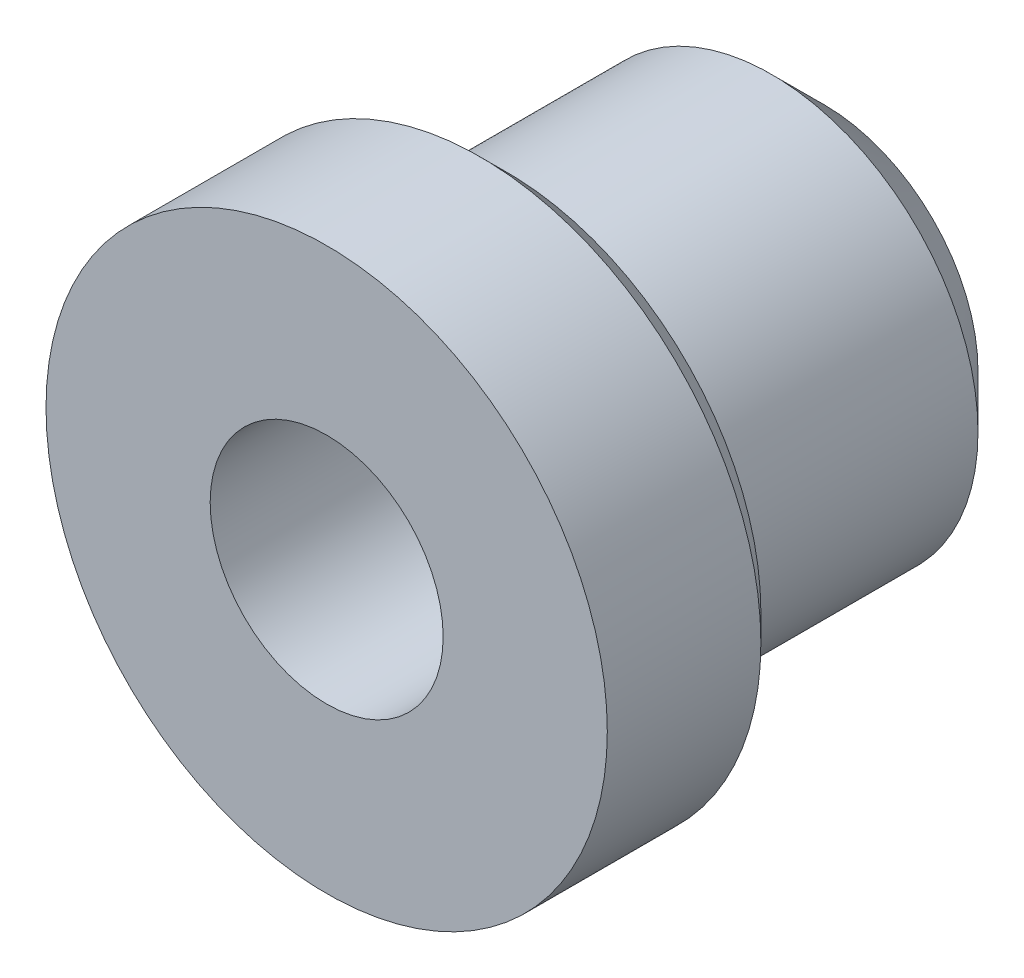
ISO-10303-21;
HEADER;
FILE_DESCRIPTION(('STEP AP214'),'2;1');
FILE_NAME('part.step','',(''),(''),'','','');
FILE_SCHEMA(('AUTOMOTIVE_DESIGN { 1 0 10303 214 1 1 1 1 }'));
ENDSEC;
DATA;
#1=APPLICATION_CONTEXT('core data for automotive mechanical design processes');
#2=APPLICATION_PROTOCOL_DEFINITION('international standard','automotive_design',2000,#1);
#3=PRODUCT_CONTEXT('',#1,'mechanical');
#4=PRODUCT('Part','Part','',(#3));
#5=PRODUCT_RELATED_PRODUCT_CATEGORY('part','',(#4));
#6=PRODUCT_DEFINITION_FORMATION('','',#4);
#7=PRODUCT_DEFINITION_CONTEXT('part definition',#1,'design');
#8=PRODUCT_DEFINITION('design','',#6,#7);
#9=PRODUCT_DEFINITION_SHAPE('','',#8);
#10=(LENGTH_UNIT() NAMED_UNIT(*) SI_UNIT(.MILLI.,.METRE.));
#11=(NAMED_UNIT(*) PLANE_ANGLE_UNIT() SI_UNIT($,.RADIAN.));
#12=(NAMED_UNIT(*) SI_UNIT($,.STERADIAN.) SOLID_ANGLE_UNIT());
#13=UNCERTAINTY_MEASURE_WITH_UNIT(LENGTH_MEASURE(1.E-05),#10,'distance_accuracy_value','');
#14=(GEOMETRIC_REPRESENTATION_CONTEXT(3) GLOBAL_UNCERTAINTY_ASSIGNED_CONTEXT((#13)) GLOBAL_UNIT_ASSIGNED_CONTEXT((#10,
#11,#12)) REPRESENTATION_CONTEXT('',''));
#15=CARTESIAN_POINT('',(0.,0.,0.));
#16=DIRECTION('',(0.,0.,1.));
#17=DIRECTION('',(1.,0.,0.));
#18=AXIS2_PLACEMENT_3D('',#15,#16,#17);
#19=CARTESIAN_POINT('',(10.0447849414046,-1.26581810736388,18.0308657865101));
#20=DIRECTION('',(0.,0.,-1.));
#21=DIRECTION('',(-1.,0.,0.));
#22=AXIS2_PLACEMENT_3D('',#19,#20,#21);
#23=CYLINDRICAL_SURFACE('',#22,1.4);
#24=CARTESIAN_POINT('',(10.0447849414046,-1.26581810736388,1.));
#25=DIRECTION('',(0.,0.,1.));
#26=DIRECTION('',(1.,0.,0.));
#27=AXIS2_PLACEMENT_3D('',#24,#25,#26);
#28=CIRCLE('',#27,1.4);
#29=CARTESIAN_POINT('',(11.4447849414046,-1.26581810736388,1.));
#30=VERTEX_POINT('',#29);
#31=EDGE_CURVE('E58',#30,#30,#28,.T.);
#32=ORIENTED_EDGE('',*,*,#31,.F.);
#33=EDGE_LOOP('',(#32));
#34=FACE_BOUND('',#33,.T.);
#35=CARTESIAN_POINT('',(10.0447849414046,-1.26581810736388,7.2));
#36=DIRECTION('',(0.,0.,1.));
#37=DIRECTION('',(1.,0.,0.));
#38=AXIS2_PLACEMENT_3D('',#35,#36,#37);
#39=CIRCLE('',#38,1.4);
#40=CARTESIAN_POINT('',(11.4447849414046,-1.26581810736388,7.2));
#41=VERTEX_POINT('',#40);
#42=EDGE_CURVE('E51',#41,#41,#39,.T.);
#43=ORIENTED_EDGE('',*,*,#42,.T.);
#44=EDGE_LOOP('',(#43));
#45=FACE_BOUND('',#44,.T.);
#46=ADVANCED_FACE('F33',(#34,#45),#23,.F.);
#47=CARTESIAN_POINT('',(10.0447849414046,-1.26581810736388,1.));
#48=DIRECTION('',(0.,0.,1.));
#49=DIRECTION('',(1.,0.,0.));
#50=AXIS2_PLACEMENT_3D('',#47,#48,#49);
#51=PLANE('',#50);
#52=CARTESIAN_POINT('',(10.0447849414046,-1.26581810736388,1.));
#53=DIRECTION('',(0.,0.,1.));
#54=DIRECTION('',(1.,0.,0.));
#55=AXIS2_PLACEMENT_3D('',#52,#53,#54);
#56=CIRCLE('',#55,2.9);
#57=CARTESIAN_POINT('',(12.9447849414046,-1.26581810736388,1.));
#58=VERTEX_POINT('',#57);
#59=EDGE_CURVE('E10',#58,#58,#56,.F.);
#60=ORIENTED_EDGE('',*,*,#59,.T.);
#61=EDGE_LOOP('',(#60));
#62=FACE_BOUND('',#61,.T.);
#63=ORIENTED_EDGE('',*,*,#31,.T.);
#64=EDGE_LOOP('',(#63));
#65=FACE_BOUND('',#64,.T.);
#66=ADVANCED_FACE('F102',(#62,#65),#51,.F.);
#67=CARTESIAN_POINT('',(10.0447849414046,-1.26581810736388,18.0308657865101));
#68=DIRECTION('',(0.,0.,-1.));
#69=DIRECTION('',(-1.,0.,0.));
#70=AXIS2_PLACEMENT_3D('',#67,#68,#69);
#71=CYLINDRICAL_SURFACE('',#70,3.9);
#72=CARTESIAN_POINT('',(10.0447849414046,-1.26581810736388,2.));
#73=DIRECTION('',(0.,0.,1.));
#74=DIRECTION('',(1.,0.,0.));
#75=AXIS2_PLACEMENT_3D('',#72,#73,#74);
#76=CIRCLE('',#75,3.9);
#77=CARTESIAN_POINT('',(13.9447849414046,-1.26581810736388,2.));
#78=VERTEX_POINT('',#77);
#79=EDGE_CURVE('E40',#78,#78,#76,.T.);
#80=ORIENTED_EDGE('',*,*,#79,.T.);
#81=EDGE_LOOP('',(#80));
#82=FACE_BOUND('',#81,.T.);
#83=CARTESIAN_POINT('',(10.0447849414046,-1.26581810736388,7.));
#84=DIRECTION('',(0.,0.,-1.));
#85=DIRECTION('',(-1.,0.,0.));
#86=AXIS2_PLACEMENT_3D('',#83,#84,#85);
#87=CIRCLE('',#86,3.9);
#88=CARTESIAN_POINT('',(6.14478494140463,-1.26581810736388,7.));
#89=VERTEX_POINT('',#88);
#90=EDGE_CURVE('E59',#89,#89,#87,.T.);
#91=ORIENTED_EDGE('',*,*,#90,.T.);
#92=EDGE_LOOP('',(#91));
#93=FACE_BOUND('',#92,.T.);
#94=ADVANCED_FACE('F85',(#82,#93),#71,.T.);
#95=CARTESIAN_POINT('',(10.0447849414046,-1.26581810736388,10.4));
#96=DIRECTION('',(0.,0.,1.));
#97=DIRECTION('',(1.,0.,0.));
#98=AXIS2_PLACEMENT_3D('',#95,#96,#97);
#99=PLANE('',#98);
#100=CARTESIAN_POINT('',(10.0447849414046,-1.26581810736388,10.4));
#101=DIRECTION('',(0.,0.,1.));
#102=DIRECTION('',(1.,0.,0.));
#103=AXIS2_PLACEMENT_3D('',#100,#101,#102);
#104=CIRCLE('',#103,2.2);
#105=CARTESIAN_POINT('',(12.2447849414046,-1.26581810736388,10.4));
#106=VERTEX_POINT('',#105);
#107=EDGE_CURVE('E66',#106,#106,#104,.T.);
#108=ORIENTED_EDGE('',*,*,#107,.F.);
#109=EDGE_LOOP('',(#108));
#110=FACE_BOUND('',#109,.T.);
#111=CARTESIAN_POINT('',(10.0447849414046,-1.26581810736388,10.4));
#112=DIRECTION('',(0.,0.,1.));
#113=DIRECTION('',(1.,0.,0.));
#114=AXIS2_PLACEMENT_3D('',#111,#112,#113);
#115=CIRCLE('',#114,5.3);
#116=CARTESIAN_POINT('',(15.3447849414046,-1.26581810736388,10.4));
#117=VERTEX_POINT('',#116);
#118=EDGE_CURVE('E53',#117,#117,#115,.T.);
#119=ORIENTED_EDGE('',*,*,#118,.T.);
#120=EDGE_LOOP('',(#119));
#121=FACE_BOUND('',#120,.T.);
#122=ADVANCED_FACE('F81',(#110,#121),#99,.T.);
#123=CARTESIAN_POINT('',(10.0447849414046,-1.26581810736388,7.));
#124=DIRECTION('',(0.,0.,1.));
#125=DIRECTION('',(1.,0.,0.));
#126=AXIS2_PLACEMENT_3D('',#123,#124,#125);
#127=PLANE('',#126);
#128=CARTESIAN_POINT('',(10.0447849414046,-1.26581810736388,7.));
#129=DIRECTION('',(0.,0.,1.));
#130=DIRECTION('',(1.,0.,0.));
#131=AXIS2_PLACEMENT_3D('',#128,#129,#130);
#132=CIRCLE('',#131,4.8);
#133=CARTESIAN_POINT('',(14.8447849414046,-1.26581810736388,7.));
#134=VERTEX_POINT('',#133);
#135=EDGE_CURVE('E44',#134,#134,#132,.F.);
#136=ORIENTED_EDGE('',*,*,#135,.T.);
#137=EDGE_LOOP('',(#136));
#138=FACE_BOUND('',#137,.T.);
#139=ORIENTED_EDGE('',*,*,#90,.F.);
#140=EDGE_LOOP('',(#139));
#141=FACE_BOUND('',#140,.T.);
#142=ADVANCED_FACE('F84',(#138,#141),#127,.F.);
#143=CARTESIAN_POINT('',(10.0447849414046,-1.26581810736388,10.4));
#144=DIRECTION('',(0.,0.,-1.));
#145=DIRECTION('',(-1.,0.,0.));
#146=AXIS2_PLACEMENT_3D('',#143,#144,#145);
#147=CYLINDRICAL_SURFACE('',#146,5.3);
#148=CARTESIAN_POINT('',(10.0447849414046,-1.26581810736388,7.5));
#149=DIRECTION('',(0.,0.,1.));
#150=DIRECTION('',(1.,0.,0.));
#151=AXIS2_PLACEMENT_3D('',#148,#149,#150);
#152=CIRCLE('',#151,5.3);
#153=CARTESIAN_POINT('',(15.3447849414046,-1.26581810736388,7.5));
#154=VERTEX_POINT('',#153);
#155=EDGE_CURVE('E48',#154,#154,#152,.T.);
#156=ORIENTED_EDGE('',*,*,#155,.T.);
#157=EDGE_LOOP('',(#156));
#158=FACE_BOUND('',#157,.T.);
#159=ORIENTED_EDGE('',*,*,#118,.F.);
#160=EDGE_LOOP('',(#159));
#161=FACE_BOUND('',#160,.T.);
#162=ADVANCED_FACE('F89',(#158,#161),#147,.T.);
#163=CARTESIAN_POINT('',(10.0447849414046,-1.26581810736388,7.5));
#164=DIRECTION('',(0.,0.,1.));
#165=DIRECTION('',(1.,0.,0.));
#166=AXIS2_PLACEMENT_3D('',#163,#164,#165);
#167=CONICAL_SURFACE('',#166,5.3,0.785398163397451);
#168=ORIENTED_EDGE('',*,*,#135,.F.);
#169=EDGE_LOOP('',(#168));
#170=FACE_BOUND('',#169,.T.);
#171=ORIENTED_EDGE('',*,*,#155,.F.);
#172=EDGE_LOOP('',(#171));
#173=FACE_BOUND('',#172,.T.);
#174=ADVANCED_FACE('F77',(#170,#173),#167,.T.);
#175=CARTESIAN_POINT('',(10.0447849414046,-1.26581810736388,7.2));
#176=DIRECTION('',(0.,0.,1.));
#177=DIRECTION('',(1.,0.,0.));
#178=AXIS2_PLACEMENT_3D('',#175,#176,#177);
#179=CYLINDRICAL_SURFACE('',#178,2.2);
#180=CARTESIAN_POINT('',(10.0447849414046,-1.26581810736388,7.2));
#181=DIRECTION('',(0.,0.,1.));
#182=DIRECTION('',(1.,0.,0.));
#183=AXIS2_PLACEMENT_3D('',#180,#181,#182);
#184=CIRCLE('',#183,2.2);
#185=CARTESIAN_POINT('',(12.2447849414046,-1.26581810736388,7.2));
#186=VERTEX_POINT('',#185);
#187=EDGE_CURVE('E54',#186,#186,#184,.T.);
#188=ORIENTED_EDGE('',*,*,#187,.F.);
#189=EDGE_LOOP('',(#188));
#190=FACE_BOUND('',#189,.T.);
#191=ORIENTED_EDGE('',*,*,#107,.T.);
#192=EDGE_LOOP('',(#191));
#193=FACE_BOUND('',#192,.T.);
#194=ADVANCED_FACE('F74',(#190,#193),#179,.F.);
#195=CARTESIAN_POINT('',(10.0447849414046,-1.26581810736388,7.2));
#196=DIRECTION('',(0.,0.,1.));
#197=DIRECTION('',(1.,0.,0.));
#198=AXIS2_PLACEMENT_3D('',#195,#196,#197);
#199=PLANE('',#198);
#200=ORIENTED_EDGE('',*,*,#42,.F.);
#201=EDGE_LOOP('',(#200));
#202=FACE_BOUND('',#201,.T.);
#203=ORIENTED_EDGE('',*,*,#187,.T.);
#204=EDGE_LOOP('',(#203));
#205=FACE_BOUND('',#204,.T.);
#206=ADVANCED_FACE('F72',(#202,#205),#199,.T.);
#207=CARTESIAN_POINT('',(10.0447849414046,-1.26581810736388,2.));
#208=DIRECTION('',(0.,0.,1.));
#209=DIRECTION('',(1.,0.,0.));
#210=AXIS2_PLACEMENT_3D('',#207,#208,#209);
#211=CONICAL_SURFACE('',#210,3.9,0.78539816339745);
#212=ORIENTED_EDGE('',*,*,#59,.F.);
#213=EDGE_LOOP('',(#212));
#214=FACE_BOUND('',#213,.T.);
#215=ORIENTED_EDGE('',*,*,#79,.F.);
#216=EDGE_LOOP('',(#215));
#217=FACE_BOUND('',#216,.T.);
#218=ADVANCED_FACE('F35',(#214,#217),#211,.T.);
#219=CLOSED_SHELL('',(#46,#66,#94,#122,#142,#162,#174,#194,#206,#218));
#220=MANIFOLD_SOLID_BREP('B2',#219);
#221=ADVANCED_BREP_SHAPE_REPRESENTATION('',(#18,#220),#14);
#222=SHAPE_DEFINITION_REPRESENTATION(#9,#221);
ENDSEC;
END-ISO-10303-21;
